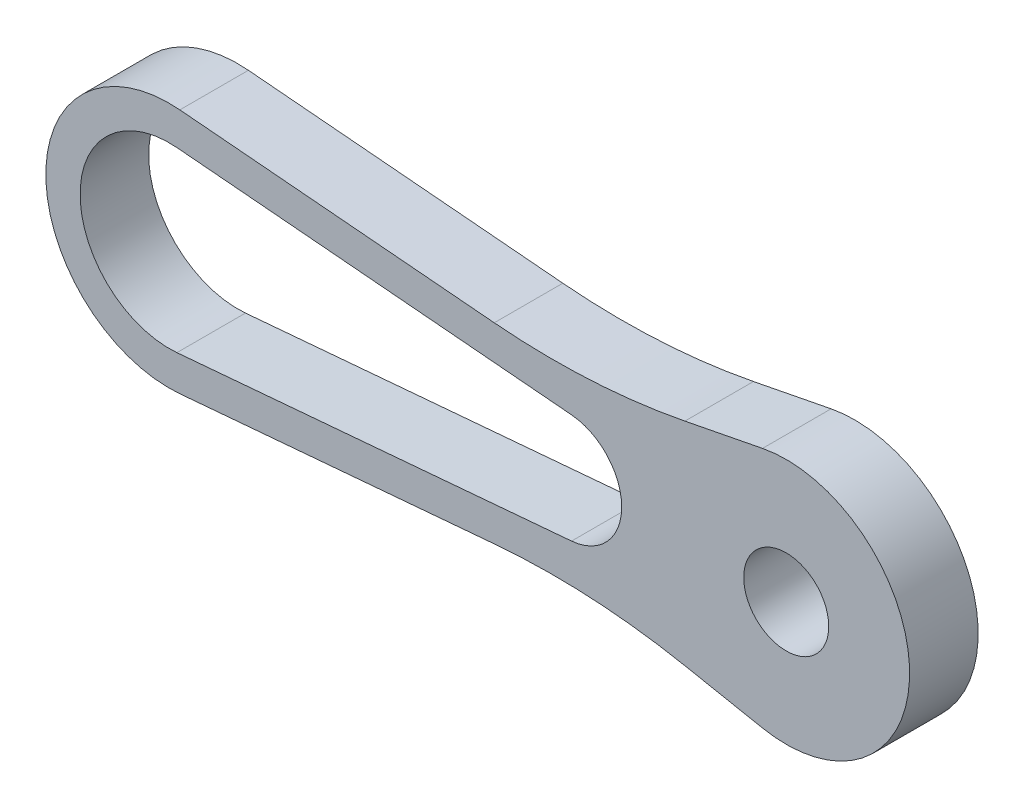
ISO-10303-21;
HEADER;
FILE_DESCRIPTION(('STEP AP214'),'2;1');
FILE_NAME('part.step','',(''),(''),'','','');
FILE_SCHEMA(('AUTOMOTIVE_DESIGN { 1 0 10303 214 1 1 1 1 }'));
ENDSEC;
DATA;
#1=APPLICATION_CONTEXT('core data for automotive mechanical design processes');
#2=APPLICATION_PROTOCOL_DEFINITION('international standard','automotive_design',2000,#1);
#3=PRODUCT_CONTEXT('',#1,'mechanical');
#4=PRODUCT('Part','Part','',(#3));
#5=PRODUCT_RELATED_PRODUCT_CATEGORY('part','',(#4));
#6=PRODUCT_DEFINITION_FORMATION('','',#4);
#7=PRODUCT_DEFINITION_CONTEXT('part definition',#1,'design');
#8=PRODUCT_DEFINITION('design','',#6,#7);
#9=PRODUCT_DEFINITION_SHAPE('','',#8);
#10=(LENGTH_UNIT() NAMED_UNIT(*) SI_UNIT(.MILLI.,.METRE.));
#11=(NAMED_UNIT(*) PLANE_ANGLE_UNIT() SI_UNIT($,.RADIAN.));
#12=(NAMED_UNIT(*) SI_UNIT($,.STERADIAN.) SOLID_ANGLE_UNIT());
#13=UNCERTAINTY_MEASURE_WITH_UNIT(LENGTH_MEASURE(1.E-05),#10,'distance_accuracy_value','');
#14=(GEOMETRIC_REPRESENTATION_CONTEXT(3) GLOBAL_UNCERTAINTY_ASSIGNED_CONTEXT((#13)) GLOBAL_UNIT_ASSIGNED_CONTEXT((#10,
#11,#12)) REPRESENTATION_CONTEXT('',''));
#15=CARTESIAN_POINT('',(0.,0.,0.));
#16=DIRECTION('',(0.,0.,1.));
#17=DIRECTION('',(1.,0.,0.));
#18=AXIS2_PLACEMENT_3D('',#15,#16,#17);
#19=CARTESIAN_POINT('',(0.,0.,5.));
#20=DIRECTION('',(0.,0.,1.));
#21=DIRECTION('',(1.,0.,0.));
#22=AXIS2_PLACEMENT_3D('',#19,#20,#21);
#23=PLANE('',#22);
#24=CARTESIAN_POINT('',(45.,0.,5.));
#25=DIRECTION('',(0.,0.,1.));
#26=DIRECTION('',(1.,0.,0.));
#27=AXIS2_PLACEMENT_3D('',#24,#25,#26);
#28=CIRCLE('',#27,3.1);
#29=CARTESIAN_POINT('',(48.1,0.,5.));
#30=VERTEX_POINT('',#29);
#31=EDGE_CURVE('E149',#30,#30,#28,.F.);
#32=ORIENTED_EDGE('',*,*,#31,.T.);
#33=EDGE_LOOP('',(#32));
#34=FACE_BOUND('',#33,.T.);
#35=CARTESIAN_POINT('',(0.,0.,5.));
#36=DIRECTION('',(0.,0.,1.));
#37=DIRECTION('',(1.,0.,0.));
#38=AXIS2_PLACEMENT_3D('',#35,#36,#37);
#39=CIRCLE('',#38,9.00000000000001);
#40=CARTESIAN_POINT('',(0.77586206896552,8.9664953047409,5.));
#41=VERTEX_POINT('',#40);
#42=CARTESIAN_POINT('',(0.775862068965522,-8.96649530474092,5.));
#43=VERTEX_POINT('',#42);
#44=EDGE_CURVE('E159',#41,#43,#39,.T.);
#45=ORIENTED_EDGE('',*,*,#44,.T.);
#46=DIRECTION('',(0.996277256082322,0.0862068965517246,0.));
#47=VECTOR('',#46,1.);
#48=CARTESIAN_POINT('',(0.775862068965522,-8.96649530474092,5.));
#49=LINE('',#48,#47);
#50=CARTESIAN_POINT('',(23.7053829456601,-6.98242628968505,5.));
#51=VERTEX_POINT('',#50);
#52=EDGE_CURVE('E162',#43,#51,#49,.T.);
#53=ORIENTED_EDGE('',*,*,#52,.T.);
#54=CARTESIAN_POINT('',(28.0157277732463,-56.7962890938011,5.));
#55=DIRECTION('',(0.,0.,-1.));
#56=DIRECTION('',(-1.,0.,0.));
#57=AXIS2_PLACEMENT_3D('',#54,#55,#56);
#58=CIRCLE('',#57,50.);
#59=CARTESIAN_POINT('',(37.6108756693774,-7.7255937976127,5.));
#60=VERTEX_POINT('',#59);
#61=EDGE_CURVE('E165',#51,#60,#58,.T.);
#62=ORIENTED_EDGE('',*,*,#61,.T.);
#63=DIRECTION('',(0.981413905923769,-0.191902957922622,0.));
#64=VECTOR('',#63,1.);
#65=CARTESIAN_POINT('',(37.6108756693774,-7.7255937976127,5.));
#66=LINE('',#65,#64);
#67=CARTESIAN_POINT('',(43.2728733786964,-8.83272515331393,5.));
#68=VERTEX_POINT('',#67);
#69=EDGE_CURVE('E167',#60,#68,#66,.T.);
#70=ORIENTED_EDGE('',*,*,#69,.T.);
#71=CARTESIAN_POINT('',(45.,0.,5.));
#72=DIRECTION('',(0.,0.,1.));
#73=DIRECTION('',(1.,0.,0.));
#74=AXIS2_PLACEMENT_3D('',#71,#72,#73);
#75=CIRCLE('',#74,9.00000000000001);
#76=CARTESIAN_POINT('',(43.2728733786964,8.83272515331392,5.));
#77=VERTEX_POINT('',#76);
#78=EDGE_CURVE('E169',#68,#77,#75,.T.);
#79=ORIENTED_EDGE('',*,*,#78,.T.);
#80=DIRECTION('',(-0.981413905923769,-0.191902957922623,0.));
#81=VECTOR('',#80,1.);
#82=CARTESIAN_POINT('',(37.6108756693774,7.72559379761269,5.));
#83=LINE('',#82,#81);
#84=CARTESIAN_POINT('',(37.6108756693774,7.72559379761268,5.));
#85=VERTEX_POINT('',#84);
#86=EDGE_CURVE('E171',#77,#85,#83,.T.);
#87=ORIENTED_EDGE('',*,*,#86,.T.);
#88=CARTESIAN_POINT('',(28.0157277732463,56.7962890938011,5.));
#89=DIRECTION('',(0.,0.,-1.));
#90=DIRECTION('',(1.,0.,0.));
#91=AXIS2_PLACEMENT_3D('',#88,#89,#90);
#92=CIRCLE('',#91,50.);
#93=CARTESIAN_POINT('',(23.7053829456601,6.98242628968503,5.));
#94=VERTEX_POINT('',#93);
#95=EDGE_CURVE('E173',#85,#94,#92,.T.);
#96=ORIENTED_EDGE('',*,*,#95,.T.);
#97=DIRECTION('',(-0.996277256082322,0.0862068965517243,0.));
#98=VECTOR('',#97,1.);
#99=CARTESIAN_POINT('',(0.77586206896552,8.9664953047409,5.));
#100=LINE('',#99,#98);
#101=EDGE_CURVE('E175',#94,#41,#100,.T.);
#102=ORIENTED_EDGE('',*,*,#101,.T.);
#103=EDGE_LOOP('',(#45,#53,#62,#70,#79,#87,#96,#102));
#104=FACE_BOUND('',#103,.T.);
#105=DIRECTION('',(0.996277256082322,0.0862068965517242,0.));
#106=VECTOR('',#105,1.);
#107=CARTESIAN_POINT('',(0.560344827586207,-6.47580216453509,5.));
#108=LINE('',#107,#106);
#109=CARTESIAN_POINT('',(0.560344827586207,-6.47580216453509,5.));
#110=VERTEX_POINT('',#109);
#111=CARTESIAN_POINT('',(29.3448275862069,-3.98510902432929,5.));
#112=VERTEX_POINT('',#111);
#113=EDGE_CURVE('E129',#110,#112,#108,.T.);
#114=ORIENTED_EDGE('',*,*,#113,.F.);
#115=CARTESIAN_POINT('',(0.,0.,5.));
#116=DIRECTION('',(0.,0.,1.));
#117=DIRECTION('',(1.,0.,0.));
#118=AXIS2_PLACEMENT_3D('',#115,#116,#117);
#119=CIRCLE('',#118,6.5);
#120=CARTESIAN_POINT('',(0.560344827586207,6.47580216453509,5.));
#121=VERTEX_POINT('',#120);
#122=EDGE_CURVE('E121',#121,#110,#119,.T.);
#123=ORIENTED_EDGE('',*,*,#122,.F.);
#124=DIRECTION('',(-0.996277256082322,0.0862068965517242,0.));
#125=VECTOR('',#124,1.);
#126=CARTESIAN_POINT('',(0.560344827586207,6.47580216453509,5.));
#127=LINE('',#126,#125);
#128=CARTESIAN_POINT('',(29.3448275862069,3.98510902432928,5.));
#129=VERTEX_POINT('',#128);
#130=EDGE_CURVE('E143',#129,#121,#127,.T.);
#131=ORIENTED_EDGE('',*,*,#130,.F.);
#132=CARTESIAN_POINT('',(29.,0.,5.));
#133=DIRECTION('',(0.,0.,1.));
#134=DIRECTION('',(1.,0.,0.));
#135=AXIS2_PLACEMENT_3D('',#132,#133,#134);
#136=CIRCLE('',#135,4.);
#137=EDGE_CURVE('E141',#112,#129,#136,.T.);
#138=ORIENTED_EDGE('',*,*,#137,.F.);
#139=EDGE_LOOP('',(#114,#123,#131,#138));
#140=FACE_BOUND('',#139,.T.);
#141=ADVANCED_FACE('F32',(#34,#104,#140),#23,.T.);
#142=CARTESIAN_POINT('',(0.,0.,0.));
#143=DIRECTION('',(0.,0.,1.));
#144=DIRECTION('',(1.,0.,0.));
#145=AXIS2_PLACEMENT_3D('',#142,#143,#144);
#146=PLANE('',#145);
#147=CARTESIAN_POINT('',(45.,0.,0.));
#148=DIRECTION('',(0.,0.,1.));
#149=DIRECTION('',(1.,0.,0.));
#150=AXIS2_PLACEMENT_3D('',#147,#148,#149);
#151=CIRCLE('',#150,3.1);
#152=CARTESIAN_POINT('',(48.1,0.,0.));
#153=VERTEX_POINT('',#152);
#154=EDGE_CURVE('E297',#153,#153,#151,.T.);
#155=ORIENTED_EDGE('',*,*,#154,.T.);
#156=EDGE_LOOP('',(#155));
#157=FACE_BOUND('',#156,.T.);
#158=CARTESIAN_POINT('',(0.,0.,0.));
#159=DIRECTION('',(0.,0.,1.));
#160=DIRECTION('',(1.,0.,0.));
#161=AXIS2_PLACEMENT_3D('',#158,#159,#160);
#162=CIRCLE('',#161,9.00000000000001);
#163=CARTESIAN_POINT('',(0.77586206896552,8.9664953047409,0.));
#164=VERTEX_POINT('',#163);
#165=CARTESIAN_POINT('',(0.775862068965522,-8.96649530474092,0.));
#166=VERTEX_POINT('',#165);
#167=EDGE_CURVE('E137',#164,#166,#162,.T.);
#168=ORIENTED_EDGE('',*,*,#167,.F.);
#169=DIRECTION('',(-0.996277256082322,0.0862068965517243,0.));
#170=VECTOR('',#169,1.);
#171=CARTESIAN_POINT('',(0.77586206896552,8.9664953047409,0.));
#172=LINE('',#171,#170);
#173=CARTESIAN_POINT('',(23.7053829456601,6.98242628968503,0.));
#174=VERTEX_POINT('',#173);
#175=EDGE_CURVE('E163',#174,#164,#172,.T.);
#176=ORIENTED_EDGE('',*,*,#175,.F.);
#177=CARTESIAN_POINT('',(28.0157277732463,56.7962890938011,0.));
#178=DIRECTION('',(0.,0.,-1.));
#179=DIRECTION('',(1.,0.,0.));
#180=AXIS2_PLACEMENT_3D('',#177,#178,#179);
#181=CIRCLE('',#180,50.);
#182=CARTESIAN_POINT('',(37.6108756693774,7.72559379761268,0.));
#183=VERTEX_POINT('',#182);
#184=EDGE_CURVE('E190',#183,#174,#181,.T.);
#185=ORIENTED_EDGE('',*,*,#184,.F.);
#186=DIRECTION('',(-0.981413905923769,-0.191902957922623,0.));
#187=VECTOR('',#186,1.);
#188=CARTESIAN_POINT('',(37.6108756693774,7.72559379761269,0.));
#189=LINE('',#188,#187);
#190=CARTESIAN_POINT('',(43.2728733786964,8.83272515331392,0.));
#191=VERTEX_POINT('',#190);
#192=EDGE_CURVE('E188',#191,#183,#189,.T.);
#193=ORIENTED_EDGE('',*,*,#192,.F.);
#194=CARTESIAN_POINT('',(45.,0.,0.));
#195=DIRECTION('',(0.,0.,1.));
#196=DIRECTION('',(1.,0.,0.));
#197=AXIS2_PLACEMENT_3D('',#194,#195,#196);
#198=CIRCLE('',#197,9.00000000000001);
#199=CARTESIAN_POINT('',(43.2728733786964,-8.83272515331393,0.));
#200=VERTEX_POINT('',#199);
#201=EDGE_CURVE('E186',#200,#191,#198,.T.);
#202=ORIENTED_EDGE('',*,*,#201,.F.);
#203=DIRECTION('',(0.981413905923769,-0.191902957922622,0.));
#204=VECTOR('',#203,1.);
#205=CARTESIAN_POINT('',(37.6108756693774,-7.7255937976127,0.));
#206=LINE('',#205,#204);
#207=CARTESIAN_POINT('',(37.6108756693774,-7.7255937976127,0.));
#208=VERTEX_POINT('',#207);
#209=EDGE_CURVE('E184',#208,#200,#206,.T.);
#210=ORIENTED_EDGE('',*,*,#209,.F.);
#211=CARTESIAN_POINT('',(28.0157277732463,-56.7962890938011,0.));
#212=DIRECTION('',(0.,0.,-1.));
#213=DIRECTION('',(-1.,0.,0.));
#214=AXIS2_PLACEMENT_3D('',#211,#212,#213);
#215=CIRCLE('',#214,50.);
#216=CARTESIAN_POINT('',(23.7053829456601,-6.98242628968505,0.));
#217=VERTEX_POINT('',#216);
#218=EDGE_CURVE('E182',#217,#208,#215,.T.);
#219=ORIENTED_EDGE('',*,*,#218,.F.);
#220=DIRECTION('',(0.996277256082322,0.0862068965517246,0.));
#221=VECTOR('',#220,1.);
#222=CARTESIAN_POINT('',(0.775862068965522,-8.96649530474092,0.));
#223=LINE('',#222,#221);
#224=EDGE_CURVE('E180',#166,#217,#223,.T.);
#225=ORIENTED_EDGE('',*,*,#224,.F.);
#226=EDGE_LOOP('',(#168,#176,#185,#193,#202,#210,#219,#225));
#227=FACE_BOUND('',#226,.T.);
#228=CARTESIAN_POINT('',(0.,0.,0.));
#229=DIRECTION('',(0.,0.,1.));
#230=DIRECTION('',(1.,0.,0.));
#231=AXIS2_PLACEMENT_3D('',#228,#229,#230);
#232=CIRCLE('',#231,6.5);
#233=CARTESIAN_POINT('',(0.560344827586207,6.47580216453509,0.));
#234=VERTEX_POINT('',#233);
#235=CARTESIAN_POINT('',(0.560344827586207,-6.47580216453509,0.));
#236=VERTEX_POINT('',#235);
#237=EDGE_CURVE('E55',#234,#236,#232,.T.);
#238=ORIENTED_EDGE('',*,*,#237,.T.);
#239=DIRECTION('',(0.996277256082322,0.0862068965517242,0.));
#240=VECTOR('',#239,1.);
#241=CARTESIAN_POINT('',(0.560344827586207,-6.47580216453509,0.));
#242=LINE('',#241,#240);
#243=CARTESIAN_POINT('',(29.3448275862069,-3.98510902432929,0.));
#244=VERTEX_POINT('',#243);
#245=EDGE_CURVE('E136',#236,#244,#242,.T.);
#246=ORIENTED_EDGE('',*,*,#245,.T.);
#247=CARTESIAN_POINT('',(29.,0.,0.));
#248=DIRECTION('',(0.,0.,1.));
#249=DIRECTION('',(1.,0.,0.));
#250=AXIS2_PLACEMENT_3D('',#247,#248,#249);
#251=CIRCLE('',#250,4.);
#252=CARTESIAN_POINT('',(29.3448275862069,3.98510902432929,0.));
#253=VERTEX_POINT('',#252);
#254=EDGE_CURVE('E151',#244,#253,#251,.T.);
#255=ORIENTED_EDGE('',*,*,#254,.T.);
#256=DIRECTION('',(-0.996277256082322,0.0862068965517242,0.));
#257=VECTOR('',#256,1.);
#258=CARTESIAN_POINT('',(0.560344827586207,6.47580216453509,0.));
#259=LINE('',#258,#257);
#260=EDGE_CURVE('E130',#253,#234,#259,.T.);
#261=ORIENTED_EDGE('',*,*,#260,.T.);
#262=EDGE_LOOP('',(#238,#246,#255,#261));
#263=FACE_BOUND('',#262,.T.);
#264=ADVANCED_FACE('F220',(#157,#227,#263),#146,.F.);
#265=CARTESIAN_POINT('',(0.,0.,5.));
#266=DIRECTION('',(0.,0.,-1.));
#267=DIRECTION('',(-1.,0.,0.));
#268=AXIS2_PLACEMENT_3D('',#265,#266,#267);
#269=CYLINDRICAL_SURFACE('',#268,9.00000000000001);
#270=ORIENTED_EDGE('',*,*,#167,.T.);
#271=DIRECTION('',(0.,0.,-1.));
#272=VECTOR('',#271,1.);
#273=CARTESIAN_POINT('',(0.775862068965522,-8.96649530474092,5.));
#274=LINE('',#273,#272);
#275=EDGE_CURVE('E11',#43,#166,#274,.T.);
#276=ORIENTED_EDGE('',*,*,#275,.F.);
#277=ORIENTED_EDGE('',*,*,#44,.F.);
#278=DIRECTION('',(0.,0.,-1.));
#279=VECTOR('',#278,1.);
#280=CARTESIAN_POINT('',(0.77586206896552,8.9664953047409,5.));
#281=LINE('',#280,#279);
#282=EDGE_CURVE('E177',#41,#164,#281,.T.);
#283=ORIENTED_EDGE('',*,*,#282,.T.);
#284=EDGE_LOOP('',(#270,#276,#277,#283));
#285=FACE_BOUND('',#284,.T.);
#286=ADVANCED_FACE('F34',(#285),#269,.T.);
#287=CARTESIAN_POINT('',(0.775862068965522,-8.96649530474092,5.));
#288=DIRECTION('',(-0.0862068965517246,0.996277256082322,0.));
#289=DIRECTION('',(-0.996277256082322,-0.0862068965517246,0.));
#290=AXIS2_PLACEMENT_3D('',#287,#288,#289);
#291=PLANE('',#290);
#292=ORIENTED_EDGE('',*,*,#224,.T.);
#293=DIRECTION('',(0.,0.,-1.));
#294=VECTOR('',#293,1.);
#295=CARTESIAN_POINT('',(23.7053829456601,-6.98242628968505,5.));
#296=LINE('',#295,#294);
#297=EDGE_CURVE('E40',#51,#217,#296,.T.);
#298=ORIENTED_EDGE('',*,*,#297,.F.);
#299=ORIENTED_EDGE('',*,*,#52,.F.);
#300=ORIENTED_EDGE('',*,*,#275,.T.);
#301=EDGE_LOOP('',(#292,#298,#299,#300));
#302=FACE_BOUND('',#301,.T.);
#303=ADVANCED_FACE('F237',(#302),#291,.F.);
#304=CARTESIAN_POINT('',(28.0157277732463,-56.7962890938011,5.));
#305=DIRECTION('',(0.,0.,-1.));
#306=DIRECTION('',(-1.,0.,0.));
#307=AXIS2_PLACEMENT_3D('',#304,#305,#306);
#308=CYLINDRICAL_SURFACE('',#307,50.);
#309=ORIENTED_EDGE('',*,*,#218,.T.);
#310=DIRECTION('',(0.,0.,-1.));
#311=VECTOR('',#310,1.);
#312=CARTESIAN_POINT('',(37.6108756693774,-7.7255937976127,5.));
#313=LINE('',#312,#311);
#314=EDGE_CURVE('E207',#60,#208,#313,.T.);
#315=ORIENTED_EDGE('',*,*,#314,.F.);
#316=ORIENTED_EDGE('',*,*,#61,.F.);
#317=ORIENTED_EDGE('',*,*,#297,.T.);
#318=EDGE_LOOP('',(#309,#315,#316,#317));
#319=FACE_BOUND('',#318,.T.);
#320=ADVANCED_FACE('F214',(#319),#308,.F.);
#321=CARTESIAN_POINT('',(37.6108756693774,-7.7255937976127,5.));
#322=DIRECTION('',(0.191902957922622,0.981413905923769,0.));
#323=DIRECTION('',(-0.981413905923769,0.191902957922622,0.));
#324=AXIS2_PLACEMENT_3D('',#321,#322,#323);
#325=PLANE('',#324);
#326=ORIENTED_EDGE('',*,*,#209,.T.);
#327=DIRECTION('',(0.,0.,-1.));
#328=VECTOR('',#327,1.);
#329=CARTESIAN_POINT('',(43.2728733786964,-8.83272515331393,5.));
#330=LINE('',#329,#328);
#331=EDGE_CURVE('E204',#68,#200,#330,.T.);
#332=ORIENTED_EDGE('',*,*,#331,.F.);
#333=ORIENTED_EDGE('',*,*,#69,.F.);
#334=ORIENTED_EDGE('',*,*,#314,.T.);
#335=EDGE_LOOP('',(#326,#332,#333,#334));
#336=FACE_BOUND('',#335,.T.);
#337=ADVANCED_FACE('F226',(#336),#325,.F.);
#338=CARTESIAN_POINT('',(45.,0.,5.));
#339=DIRECTION('',(0.,0.,-1.));
#340=DIRECTION('',(-1.,0.,0.));
#341=AXIS2_PLACEMENT_3D('',#338,#339,#340);
#342=CYLINDRICAL_SURFACE('',#341,9.00000000000001);
#343=ORIENTED_EDGE('',*,*,#201,.T.);
#344=DIRECTION('',(0.,0.,-1.));
#345=VECTOR('',#344,1.);
#346=CARTESIAN_POINT('',(43.2728733786964,8.83272515331392,5.));
#347=LINE('',#346,#345);
#348=EDGE_CURVE('E201',#77,#191,#347,.T.);
#349=ORIENTED_EDGE('',*,*,#348,.F.);
#350=ORIENTED_EDGE('',*,*,#78,.F.);
#351=ORIENTED_EDGE('',*,*,#331,.T.);
#352=EDGE_LOOP('',(#343,#349,#350,#351));
#353=FACE_BOUND('',#352,.T.);
#354=ADVANCED_FACE('F230',(#353),#342,.T.);
#355=CARTESIAN_POINT('',(37.6108756693774,7.72559379761269,5.));
#356=DIRECTION('',(0.191902957922623,-0.981413905923769,0.));
#357=DIRECTION('',(0.981413905923769,0.191902957922623,0.));
#358=AXIS2_PLACEMENT_3D('',#355,#356,#357);
#359=PLANE('',#358);
#360=ORIENTED_EDGE('',*,*,#192,.T.);
#361=DIRECTION('',(0.,0.,-1.));
#362=VECTOR('',#361,1.);
#363=CARTESIAN_POINT('',(37.6108756693774,7.72559379761268,5.));
#364=LINE('',#363,#362);
#365=EDGE_CURVE('E198',#85,#183,#364,.T.);
#366=ORIENTED_EDGE('',*,*,#365,.F.);
#367=ORIENTED_EDGE('',*,*,#86,.F.);
#368=ORIENTED_EDGE('',*,*,#348,.T.);
#369=EDGE_LOOP('',(#360,#366,#367,#368));
#370=FACE_BOUND('',#369,.T.);
#371=ADVANCED_FACE('F250',(#370),#359,.F.);
#372=CARTESIAN_POINT('',(28.0157277732463,56.7962890938011,5.));
#373=DIRECTION('',(0.,0.,-1.));
#374=DIRECTION('',(-1.,0.,0.));
#375=AXIS2_PLACEMENT_3D('',#372,#373,#374);
#376=CYLINDRICAL_SURFACE('',#375,50.);
#377=ORIENTED_EDGE('',*,*,#184,.T.);
#378=DIRECTION('',(0.,0.,-1.));
#379=VECTOR('',#378,1.);
#380=CARTESIAN_POINT('',(23.7053829456601,6.98242628968503,5.));
#381=LINE('',#380,#379);
#382=EDGE_CURVE('E195',#94,#174,#381,.T.);
#383=ORIENTED_EDGE('',*,*,#382,.F.);
#384=ORIENTED_EDGE('',*,*,#95,.F.);
#385=ORIENTED_EDGE('',*,*,#365,.T.);
#386=EDGE_LOOP('',(#377,#383,#384,#385));
#387=FACE_BOUND('',#386,.T.);
#388=ADVANCED_FACE('F248',(#387),#376,.F.);
#389=CARTESIAN_POINT('',(0.77586206896552,8.9664953047409,5.));
#390=DIRECTION('',(-0.0862068965517243,-0.996277256082322,0.));
#391=DIRECTION('',(0.996277256082322,-0.0862068965517243,0.));
#392=AXIS2_PLACEMENT_3D('',#389,#390,#391);
#393=PLANE('',#392);
#394=ORIENTED_EDGE('',*,*,#175,.T.);
#395=ORIENTED_EDGE('',*,*,#282,.F.);
#396=ORIENTED_EDGE('',*,*,#101,.F.);
#397=ORIENTED_EDGE('',*,*,#382,.T.);
#398=EDGE_LOOP('',(#394,#395,#396,#397));
#399=FACE_BOUND('',#398,.T.);
#400=ADVANCED_FACE('F243',(#399),#393,.F.);
#401=CARTESIAN_POINT('',(0.,0.,5.));
#402=DIRECTION('',(0.,0.,-1.));
#403=DIRECTION('',(-1.,0.,0.));
#404=AXIS2_PLACEMENT_3D('',#401,#402,#403);
#405=CYLINDRICAL_SURFACE('',#404,6.5);
#406=ORIENTED_EDGE('',*,*,#237,.F.);
#407=DIRECTION('',(0.,0.,-1.));
#408=VECTOR('',#407,1.);
#409=CARTESIAN_POINT('',(0.560344827586207,6.47580216453509,5.));
#410=LINE('',#409,#408);
#411=EDGE_CURVE('E125',#121,#234,#410,.T.);
#412=ORIENTED_EDGE('',*,*,#411,.F.);
#413=ORIENTED_EDGE('',*,*,#122,.T.);
#414=DIRECTION('',(0.,0.,-1.));
#415=VECTOR('',#414,1.);
#416=CARTESIAN_POINT('',(0.560344827586207,-6.47580216453509,5.));
#417=LINE('',#416,#415);
#418=EDGE_CURVE('E124',#110,#236,#417,.T.);
#419=ORIENTED_EDGE('',*,*,#418,.T.);
#420=EDGE_LOOP('',(#406,#412,#413,#419));
#421=FACE_BOUND('',#420,.T.);
#422=ADVANCED_FACE('F123',(#421),#405,.F.);
#423=CARTESIAN_POINT('',(0.560344827586207,-6.47580216453509,5.));
#424=DIRECTION('',(-0.0862068965517242,0.996277256082322,0.));
#425=DIRECTION('',(-0.996277256082322,-0.0862068965517242,0.));
#426=AXIS2_PLACEMENT_3D('',#423,#424,#425);
#427=PLANE('',#426);
#428=ORIENTED_EDGE('',*,*,#245,.F.);
#429=ORIENTED_EDGE('',*,*,#418,.F.);
#430=ORIENTED_EDGE('',*,*,#113,.T.);
#431=DIRECTION('',(0.,0.,-1.));
#432=VECTOR('',#431,1.);
#433=CARTESIAN_POINT('',(29.3448275862069,-3.98510902432929,5.));
#434=LINE('',#433,#432);
#435=EDGE_CURVE('E138',#112,#244,#434,.T.);
#436=ORIENTED_EDGE('',*,*,#435,.T.);
#437=EDGE_LOOP('',(#428,#429,#430,#436));
#438=FACE_BOUND('',#437,.T.);
#439=ADVANCED_FACE('F133',(#438),#427,.T.);
#440=CARTESIAN_POINT('',(29.,0.,5.));
#441=DIRECTION('',(0.,0.,-1.));
#442=DIRECTION('',(-1.,0.,0.));
#443=AXIS2_PLACEMENT_3D('',#440,#441,#442);
#444=CYLINDRICAL_SURFACE('',#443,4.);
#445=ORIENTED_EDGE('',*,*,#254,.F.);
#446=ORIENTED_EDGE('',*,*,#435,.F.);
#447=ORIENTED_EDGE('',*,*,#137,.T.);
#448=DIRECTION('',(0.,0.,-1.));
#449=VECTOR('',#448,1.);
#450=CARTESIAN_POINT('',(29.3448275862069,3.98510902432929,5.));
#451=LINE('',#450,#449);
#452=EDGE_CURVE('E47',#129,#253,#451,.T.);
#453=ORIENTED_EDGE('',*,*,#452,.T.);
#454=EDGE_LOOP('',(#445,#446,#447,#453));
#455=FACE_BOUND('',#454,.T.);
#456=ADVANCED_FACE('F278',(#455),#444,.F.);
#457=CARTESIAN_POINT('',(0.560344827586207,6.47580216453509,5.));
#458=DIRECTION('',(-0.0862068965517242,-0.996277256082322,0.));
#459=DIRECTION('',(0.996277256082322,-0.0862068965517242,0.));
#460=AXIS2_PLACEMENT_3D('',#457,#458,#459);
#461=PLANE('',#460);
#462=ORIENTED_EDGE('',*,*,#260,.F.);
#463=ORIENTED_EDGE('',*,*,#452,.F.);
#464=ORIENTED_EDGE('',*,*,#130,.T.);
#465=ORIENTED_EDGE('',*,*,#411,.T.);
#466=EDGE_LOOP('',(#462,#463,#464,#465));
#467=FACE_BOUND('',#466,.T.);
#468=ADVANCED_FACE('F282',(#467),#461,.T.);
#469=CARTESIAN_POINT('',(45.,0.,10.));
#470=DIRECTION('',(0.,0.,-1.));
#471=DIRECTION('',(-1.,0.,0.));
#472=AXIS2_PLACEMENT_3D('',#469,#470,#471);
#473=CYLINDRICAL_SURFACE('',#472,3.1);
#474=ORIENTED_EDGE('',*,*,#31,.F.);
#475=EDGE_LOOP('',(#474));
#476=FACE_BOUND('',#475,.T.);
#477=ORIENTED_EDGE('',*,*,#154,.F.);
#478=EDGE_LOOP('',(#477));
#479=FACE_BOUND('',#478,.T.);
#480=ADVANCED_FACE('F288',(#476,#479),#473,.F.);
#481=CLOSED_SHELL('',(#141,#264,#286,#303,#320,#337,#354,#371,#388,#400,#422,#439,#456,#468,#480));
#482=MANIFOLD_SOLID_BREP('B2',#481);
#483=ADVANCED_BREP_SHAPE_REPRESENTATION('',(#18,#482),#14);
#484=SHAPE_DEFINITION_REPRESENTATION(#9,#483);
ENDSEC;
END-ISO-10303-21;
